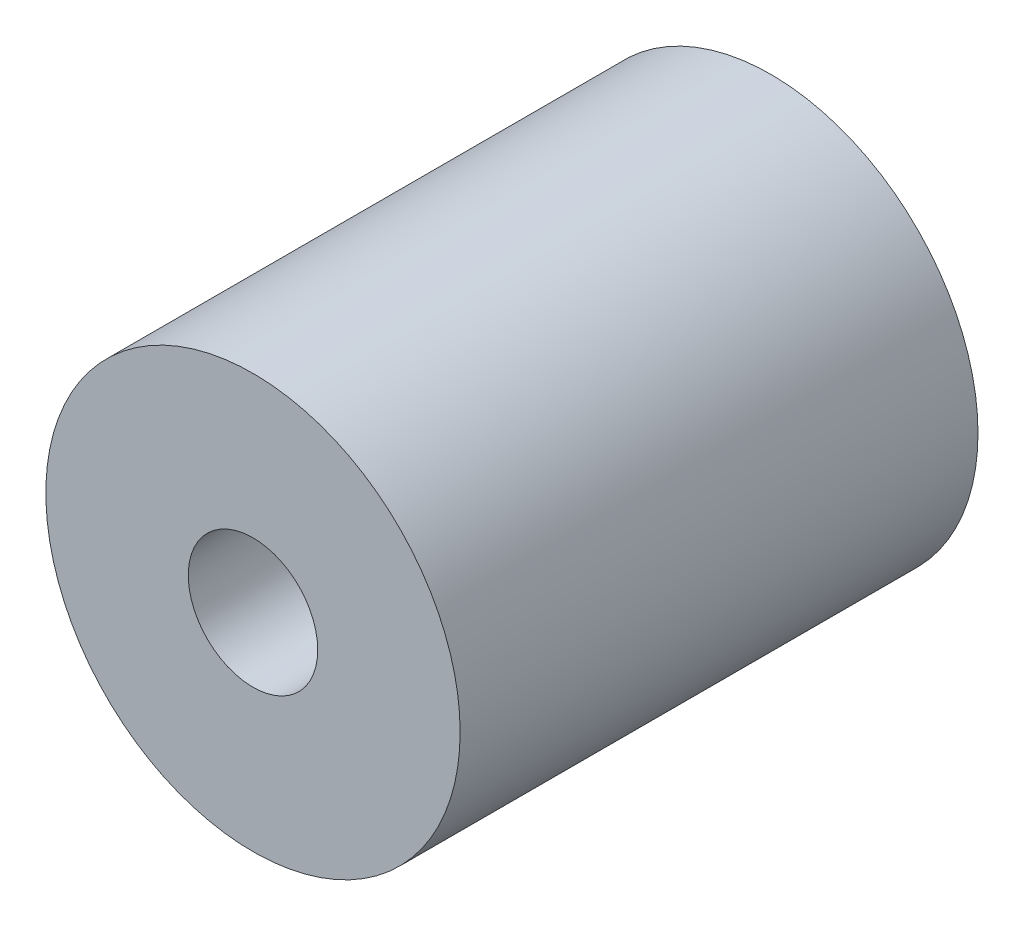
ISO-10303-21;
HEADER;
FILE_DESCRIPTION(('STEP AP214'),'2;1');
FILE_NAME('part.step','',(''),(''),'','','');
FILE_SCHEMA(('AUTOMOTIVE_DESIGN { 1 0 10303 214 1 1 1 1 }'));
ENDSEC;
DATA;
#1=APPLICATION_CONTEXT('core data for automotive mechanical design processes');
#2=APPLICATION_PROTOCOL_DEFINITION('international standard','automotive_design',2000,#1);
#3=PRODUCT_CONTEXT('',#1,'mechanical');
#4=PRODUCT('Part','Part','',(#3));
#5=PRODUCT_RELATED_PRODUCT_CATEGORY('part','',(#4));
#6=PRODUCT_DEFINITION_FORMATION('','',#4);
#7=PRODUCT_DEFINITION_CONTEXT('part definition',#1,'design');
#8=PRODUCT_DEFINITION('design','',#6,#7);
#9=PRODUCT_DEFINITION_SHAPE('','',#8);
#10=(LENGTH_UNIT() NAMED_UNIT(*) SI_UNIT(.MILLI.,.METRE.));
#11=(NAMED_UNIT(*) PLANE_ANGLE_UNIT() SI_UNIT($,.RADIAN.));
#12=(NAMED_UNIT(*) SI_UNIT($,.STERADIAN.) SOLID_ANGLE_UNIT());
#13=UNCERTAINTY_MEASURE_WITH_UNIT(LENGTH_MEASURE(1.E-05),#10,'distance_accuracy_value','');
#14=(GEOMETRIC_REPRESENTATION_CONTEXT(3) GLOBAL_UNCERTAINTY_ASSIGNED_CONTEXT((#13)) GLOBAL_UNIT_ASSIGNED_CONTEXT((#10,
#11,#12)) REPRESENTATION_CONTEXT('',''));
#15=CARTESIAN_POINT('',(0.,0.,0.));
#16=DIRECTION('',(0.,0.,1.));
#17=DIRECTION('',(1.,0.,0.));
#18=AXIS2_PLACEMENT_3D('',#15,#16,#17);
#19=CARTESIAN_POINT('',(0.,0.,10.));
#20=DIRECTION('',(0.,0.,-1.));
#21=DIRECTION('',(-1.,0.,0.));
#22=AXIS2_PLACEMENT_3D('',#19,#20,#21);
#23=CYLINDRICAL_SURFACE('',#22,4.);
#24=CARTESIAN_POINT('',(0.,0.,10.));
#25=DIRECTION('',(0.,0.,1.));
#26=DIRECTION('',(1.,0.,0.));
#27=AXIS2_PLACEMENT_3D('',#24,#25,#26);
#28=CIRCLE('',#27,4.);
#29=CARTESIAN_POINT('',(4.,0.,10.));
#30=VERTEX_POINT('',#29);
#31=EDGE_CURVE('E10',#30,#30,#28,.T.);
#32=ORIENTED_EDGE('',*,*,#31,.F.);
#33=EDGE_LOOP('',(#32));
#34=FACE_BOUND('',#33,.T.);
#35=CARTESIAN_POINT('',(0.,0.,0.));
#36=DIRECTION('',(0.,0.,1.));
#37=DIRECTION('',(1.,0.,0.));
#38=AXIS2_PLACEMENT_3D('',#35,#36,#37);
#39=CIRCLE('',#38,4.);
#40=CARTESIAN_POINT('',(4.,0.,0.));
#41=VERTEX_POINT('',#40);
#42=EDGE_CURVE('E35',#41,#41,#39,.T.);
#43=ORIENTED_EDGE('',*,*,#42,.T.);
#44=EDGE_LOOP('',(#43));
#45=FACE_BOUND('',#44,.T.);
#46=ADVANCED_FACE('F32',(#34,#45),#23,.T.);
#47=CARTESIAN_POINT('',(0.,0.,10.));
#48=DIRECTION('',(0.,0.,1.));
#49=DIRECTION('',(1.,0.,0.));
#50=AXIS2_PLACEMENT_3D('',#47,#48,#49);
#51=PLANE('',#50);
#52=CARTESIAN_POINT('',(0.,0.,10.));
#53=DIRECTION('',(0.,0.,1.));
#54=DIRECTION('',(1.,0.,0.));
#55=AXIS2_PLACEMENT_3D('',#52,#53,#54);
#56=CIRCLE('',#55,1.24999999999999);
#57=CARTESIAN_POINT('',(1.24999999999999,0.,10.));
#58=VERTEX_POINT('',#57);
#59=EDGE_CURVE('E46',#58,#58,#56,.T.);
#60=ORIENTED_EDGE('',*,*,#59,.F.);
#61=EDGE_LOOP('',(#60));
#62=FACE_BOUND('',#61,.T.);
#63=ORIENTED_EDGE('',*,*,#31,.T.);
#64=EDGE_LOOP('',(#63));
#65=FACE_BOUND('',#64,.T.);
#66=ADVANCED_FACE('F52',(#62,#65),#51,.T.);
#67=CARTESIAN_POINT('',(0.,0.,0.));
#68=DIRECTION('',(0.,0.,1.));
#69=DIRECTION('',(1.,0.,0.));
#70=AXIS2_PLACEMENT_3D('',#67,#68,#69);
#71=PLANE('',#70);
#72=CARTESIAN_POINT('',(0.,0.,0.));
#73=DIRECTION('',(0.,0.,1.));
#74=DIRECTION('',(1.,0.,0.));
#75=AXIS2_PLACEMENT_3D('',#72,#73,#74);
#76=CIRCLE('',#75,1.25);
#77=CARTESIAN_POINT('',(1.25,0.,0.));
#78=VERTEX_POINT('',#77);
#79=EDGE_CURVE('E42',#78,#78,#76,.T.);
#80=ORIENTED_EDGE('',*,*,#79,.T.);
#81=EDGE_LOOP('',(#80));
#82=FACE_BOUND('',#81,.T.);
#83=ORIENTED_EDGE('',*,*,#42,.F.);
#84=EDGE_LOOP('',(#83));
#85=FACE_BOUND('',#84,.T.);
#86=ADVANCED_FACE('F54',(#82,#85),#71,.F.);
#87=CARTESIAN_POINT('',(0.,0.,10.));
#88=DIRECTION('',(0.,0.,1.));
#89=DIRECTION('',(1.,0.,0.));
#90=AXIS2_PLACEMENT_3D('',#87,#88,#89);
#91=CYLINDRICAL_SURFACE('',#90,1.24999999999999);
#92=ORIENTED_EDGE('',*,*,#79,.F.);
#93=EDGE_LOOP('',(#92));
#94=FACE_BOUND('',#93,.T.);
#95=ORIENTED_EDGE('',*,*,#59,.T.);
#96=EDGE_LOOP('',(#95));
#97=FACE_BOUND('',#96,.T.);
#98=ADVANCED_FACE('F50',(#94,#97),#91,.F.);
#99=CLOSED_SHELL('',(#46,#66,#86,#98));
#100=MANIFOLD_SOLID_BREP('B2',#99);
#101=ADVANCED_BREP_SHAPE_REPRESENTATION('',(#18,#100),#14);
#102=SHAPE_DEFINITION_REPRESENTATION(#9,#101);
ENDSEC;
END-ISO-10303-21;
